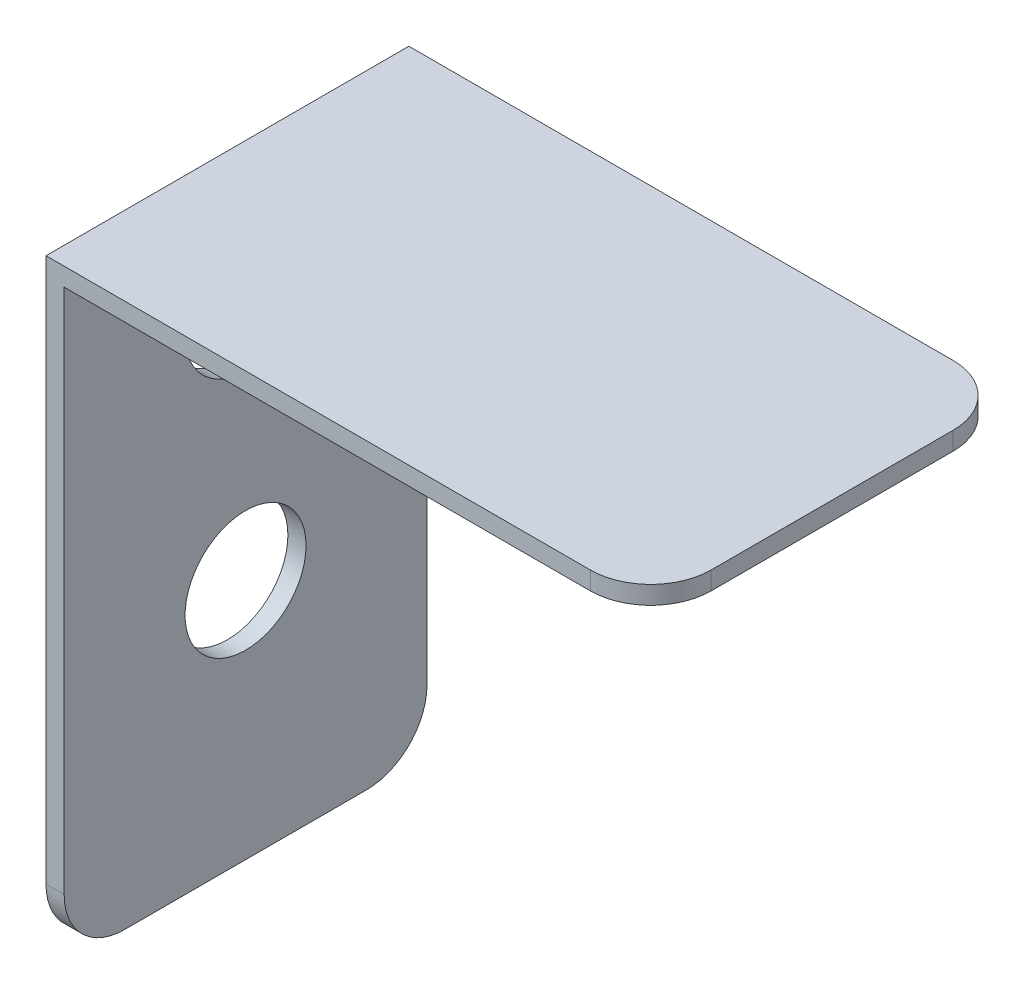
ISO-10303-21;
HEADER;
FILE_DESCRIPTION(('STEP AP214'),'2;1');
FILE_NAME('part.step','',(''),(''),'','','');
FILE_SCHEMA(('AUTOMOTIVE_DESIGN { 1 0 10303 214 1 1 1 1 }'));
ENDSEC;
DATA;
#1=APPLICATION_CONTEXT('core data for automotive mechanical design processes');
#2=APPLICATION_PROTOCOL_DEFINITION('international standard','automotive_design',2000,#1);
#3=PRODUCT_CONTEXT('',#1,'mechanical');
#4=PRODUCT('Part','Part','',(#3));
#5=PRODUCT_RELATED_PRODUCT_CATEGORY('part','',(#4));
#6=PRODUCT_DEFINITION_FORMATION('','',#4);
#7=PRODUCT_DEFINITION_CONTEXT('part definition',#1,'design');
#8=PRODUCT_DEFINITION('design','',#6,#7);
#9=PRODUCT_DEFINITION_SHAPE('','',#8);
#10=(LENGTH_UNIT() NAMED_UNIT(*) SI_UNIT(.MILLI.,.METRE.));
#11=(NAMED_UNIT(*) PLANE_ANGLE_UNIT() SI_UNIT($,.RADIAN.));
#12=(NAMED_UNIT(*) SI_UNIT($,.STERADIAN.) SOLID_ANGLE_UNIT());
#13=UNCERTAINTY_MEASURE_WITH_UNIT(LENGTH_MEASURE(1.E-05),#10,'distance_accuracy_value','');
#14=(GEOMETRIC_REPRESENTATION_CONTEXT(3) GLOBAL_UNCERTAINTY_ASSIGNED_CONTEXT((#13)) GLOBAL_UNIT_ASSIGNED_CONTEXT((#10,
#11,#12)) REPRESENTATION_CONTEXT('',''));
#15=CARTESIAN_POINT('',(0.,0.,0.));
#16=DIRECTION('',(0.,0.,1.));
#17=DIRECTION('',(1.,0.,0.));
#18=AXIS2_PLACEMENT_3D('',#15,#16,#17);
#19=CARTESIAN_POINT('',(0.,0.,60.));
#20=DIRECTION('',(0.,1.,0.));
#21=DIRECTION('',(0.,0.,1.));
#22=AXIS2_PLACEMENT_3D('',#19,#20,#21);
#23=PLANE('',#22);
#24=DIRECTION('',(0.,0.,-1.));
#25=VECTOR('',#24,1.);
#26=CARTESIAN_POINT('',(0.,0.,60.));
#27=LINE('',#26,#25);
#28=CARTESIAN_POINT('',(0.,0.,50.));
#29=VERTEX_POINT('',#28);
#30=CARTESIAN_POINT('',(0.,0.,10.));
#31=VERTEX_POINT('',#30);
#32=EDGE_CURVE('E173',#29,#31,#27,.T.);
#33=ORIENTED_EDGE('',*,*,#32,.T.);
#34=DIRECTION('',(1.,0.,0.));
#35=VECTOR('',#34,1.);
#36=CARTESIAN_POINT('',(0.,0.,10.));
#37=LINE('',#36,#35);
#38=CARTESIAN_POINT('',(3.,0.,10.));
#39=VERTEX_POINT('',#38);
#40=EDGE_CURVE('E201',#31,#39,#37,.T.);
#41=ORIENTED_EDGE('',*,*,#40,.T.);
#42=DIRECTION('',(0.,0.,-1.));
#43=VECTOR('',#42,1.);
#44=CARTESIAN_POINT('',(3.,0.,60.));
#45=LINE('',#44,#43);
#46=CARTESIAN_POINT('',(3.,0.,50.));
#47=VERTEX_POINT('',#46);
#48=EDGE_CURVE('E156',#47,#39,#45,.T.);
#49=ORIENTED_EDGE('',*,*,#48,.F.);
#50=DIRECTION('',(1.,0.,0.));
#51=VECTOR('',#50,1.);
#52=CARTESIAN_POINT('',(0.,0.,50.));
#53=LINE('',#52,#51);
#54=EDGE_CURVE('E205',#47,#29,#53,.F.);
#55=ORIENTED_EDGE('',*,*,#54,.T.);
#56=EDGE_LOOP('',(#33,#41,#49,#55));
#57=FACE_BOUND('',#56,.T.);
#58=ADVANCED_FACE('F50',(#57),#23,.F.);
#59=CARTESIAN_POINT('',(3.,0.,60.));
#60=DIRECTION('',(-1.,0.,0.));
#61=DIRECTION('',(0.,0.,1.));
#62=AXIS2_PLACEMENT_3D('',#59,#60,#61);
#63=PLANE('',#62);
#64=CARTESIAN_POINT('',(3.,40.,30.));
#65=DIRECTION('',(1.,0.,0.));
#66=DIRECTION('',(0.,0.,-1.));
#67=AXIS2_PLACEMENT_3D('',#64,#65,#66);
#68=CIRCLE('',#67,10.);
#69=CARTESIAN_POINT('',(3.,40.,20.));
#70=VERTEX_POINT('',#69);
#71=EDGE_CURVE('E187',#70,#70,#68,.T.);
#72=ORIENTED_EDGE('',*,*,#71,.F.);
#73=EDGE_LOOP('',(#72));
#74=FACE_BOUND('',#73,.T.);
#75=CARTESIAN_POINT('',(3.,80.,30.));
#76=DIRECTION('',(1.,0.,0.));
#77=DIRECTION('',(0.,0.,-1.));
#78=AXIS2_PLACEMENT_3D('',#75,#76,#77);
#79=CIRCLE('',#78,10.);
#80=CARTESIAN_POINT('',(3.,80.,20.));
#81=VERTEX_POINT('',#80);
#82=EDGE_CURVE('E256',#81,#81,#79,.T.);
#83=ORIENTED_EDGE('',*,*,#82,.F.);
#84=EDGE_LOOP('',(#83));
#85=FACE_BOUND('',#84,.T.);
#86=ORIENTED_EDGE('',*,*,#48,.T.);
#87=CARTESIAN_POINT('',(3.,10.,10.));
#88=DIRECTION('',(-1.,0.,0.));
#89=DIRECTION('',(0.,0.,1.));
#90=AXIS2_PLACEMENT_3D('',#87,#88,#89);
#91=CIRCLE('',#90,10.);
#92=CARTESIAN_POINT('',(3.,10.,0.));
#93=VERTEX_POINT('',#92);
#94=EDGE_CURVE('E195',#39,#93,#91,.F.);
#95=ORIENTED_EDGE('',*,*,#94,.T.);
#96=DIRECTION('',(0.,1.,0.));
#97=VECTOR('',#96,1.);
#98=CARTESIAN_POINT('',(3.,0.,0.));
#99=LINE('',#98,#97);
#100=CARTESIAN_POINT('',(3.,97.,0.));
#101=VERTEX_POINT('',#100);
#102=EDGE_CURVE('E151',#93,#101,#99,.T.);
#103=ORIENTED_EDGE('',*,*,#102,.T.);
#104=DIRECTION('',(0.,0.,-1.));
#105=VECTOR('',#104,1.);
#106=CARTESIAN_POINT('',(3.,97.,60.));
#107=LINE('',#106,#105);
#108=CARTESIAN_POINT('',(3.,97.,60.));
#109=VERTEX_POINT('',#108);
#110=EDGE_CURVE('E148',#109,#101,#107,.T.);
#111=ORIENTED_EDGE('',*,*,#110,.F.);
#112=DIRECTION('',(0.,1.,0.));
#113=VECTOR('',#112,1.);
#114=CARTESIAN_POINT('',(3.,0.,60.));
#115=LINE('',#114,#113);
#116=CARTESIAN_POINT('',(3.,10.,60.));
#117=VERTEX_POINT('',#116);
#118=EDGE_CURVE('E135',#117,#109,#115,.T.);
#119=ORIENTED_EDGE('',*,*,#118,.F.);
#120=CARTESIAN_POINT('',(3.,10.,50.));
#121=DIRECTION('',(-1.,0.,0.));
#122=DIRECTION('',(0.,0.,1.));
#123=AXIS2_PLACEMENT_3D('',#120,#121,#122);
#124=CIRCLE('',#123,10.);
#125=EDGE_CURVE('E198',#117,#47,#124,.F.);
#126=ORIENTED_EDGE('',*,*,#125,.T.);
#127=EDGE_LOOP('',(#86,#95,#103,#111,#119,#126));
#128=FACE_BOUND('',#127,.T.);
#129=ADVANCED_FACE('F150',(#74,#85,#128),#63,.F.);
#130=CARTESIAN_POINT('',(3.,97.,60.));
#131=DIRECTION('',(0.,1.,0.));
#132=DIRECTION('',(0.,0.,1.));
#133=AXIS2_PLACEMENT_3D('',#130,#131,#132);
#134=PLANE('',#133);
#135=DIRECTION('',(1.,0.,0.));
#136=VECTOR('',#135,1.);
#137=CARTESIAN_POINT('',(3.,97.,0.));
#138=LINE('',#137,#136);
#139=CARTESIAN_POINT('',(90.,97.,0.));
#140=VERTEX_POINT('',#139);
#141=EDGE_CURVE('E176',#101,#140,#138,.T.);
#142=ORIENTED_EDGE('',*,*,#141,.T.);
#143=CARTESIAN_POINT('',(90.,97.,10.));
#144=DIRECTION('',(0.,1.,0.));
#145=DIRECTION('',(0.,0.,1.));
#146=AXIS2_PLACEMENT_3D('',#143,#144,#145);
#147=CIRCLE('',#146,10.);
#148=CARTESIAN_POINT('',(100.,97.,10.));
#149=VERTEX_POINT('',#148);
#150=EDGE_CURVE('E211',#140,#149,#147,.F.);
#151=ORIENTED_EDGE('',*,*,#150,.T.);
#152=DIRECTION('',(0.,0.,-1.));
#153=VECTOR('',#152,1.);
#154=CARTESIAN_POINT('',(100.,97.,60.));
#155=LINE('',#154,#153);
#156=CARTESIAN_POINT('',(100.,97.,50.));
#157=VERTEX_POINT('',#156);
#158=EDGE_CURVE('E157',#157,#149,#155,.T.);
#159=ORIENTED_EDGE('',*,*,#158,.F.);
#160=CARTESIAN_POINT('',(90.,97.,50.));
#161=DIRECTION('',(0.,1.,0.));
#162=DIRECTION('',(0.,0.,1.));
#163=AXIS2_PLACEMENT_3D('',#160,#161,#162);
#164=CIRCLE('',#163,10.);
#165=CARTESIAN_POINT('',(90.,97.,60.));
#166=VERTEX_POINT('',#165);
#167=EDGE_CURVE('E162',#157,#166,#164,.F.);
#168=ORIENTED_EDGE('',*,*,#167,.T.);
#169=DIRECTION('',(1.,0.,0.));
#170=VECTOR('',#169,1.);
#171=CARTESIAN_POINT('',(3.,97.,60.));
#172=LINE('',#171,#170);
#173=EDGE_CURVE('E140',#109,#166,#172,.T.);
#174=ORIENTED_EDGE('',*,*,#173,.F.);
#175=ORIENTED_EDGE('',*,*,#110,.T.);
#176=EDGE_LOOP('',(#142,#151,#159,#168,#174,#175));
#177=FACE_BOUND('',#176,.T.);
#178=ADVANCED_FACE('F159',(#177),#134,.F.);
#179=CARTESIAN_POINT('',(100.,100.,60.));
#180=DIRECTION('',(-1.,0.,0.));
#181=DIRECTION('',(0.,0.,1.));
#182=AXIS2_PLACEMENT_3D('',#179,#180,#181);
#183=PLANE('',#182);
#184=ORIENTED_EDGE('',*,*,#158,.T.);
#185=DIRECTION('',(0.,1.,0.));
#186=VECTOR('',#185,1.);
#187=CARTESIAN_POINT('',(100.,100.,10.));
#188=LINE('',#187,#186);
#189=CARTESIAN_POINT('',(100.,100.,10.));
#190=VERTEX_POINT('',#189);
#191=EDGE_CURVE('E225',#149,#190,#188,.T.);
#192=ORIENTED_EDGE('',*,*,#191,.T.);
#193=DIRECTION('',(0.,0.,-1.));
#194=VECTOR('',#193,1.);
#195=CARTESIAN_POINT('',(100.,100.,60.));
#196=LINE('',#195,#194);
#197=CARTESIAN_POINT('',(100.,100.,50.));
#198=VERTEX_POINT('',#197);
#199=EDGE_CURVE('E237',#198,#190,#196,.T.);
#200=ORIENTED_EDGE('',*,*,#199,.F.);
#201=DIRECTION('',(0.,1.,0.));
#202=VECTOR('',#201,1.);
#203=CARTESIAN_POINT('',(100.,97.,50.));
#204=LINE('',#203,#202);
#205=EDGE_CURVE('E229',#198,#157,#204,.F.);
#206=ORIENTED_EDGE('',*,*,#205,.T.);
#207=EDGE_LOOP('',(#184,#192,#200,#206));
#208=FACE_BOUND('',#207,.T.);
#209=ADVANCED_FACE('F271',(#208),#183,.F.);
#210=CARTESIAN_POINT('',(0.,100.,60.));
#211=DIRECTION('',(0.,-1.,0.));
#212=DIRECTION('',(0.,0.,-1.));
#213=AXIS2_PLACEMENT_3D('',#210,#211,#212);
#214=PLANE('',#213);
#215=ORIENTED_EDGE('',*,*,#199,.T.);
#216=CARTESIAN_POINT('',(90.,100.,10.));
#217=DIRECTION('',(0.,-1.,0.));
#218=DIRECTION('',(0.,0.,-1.));
#219=AXIS2_PLACEMENT_3D('',#216,#217,#218);
#220=CIRCLE('',#219,10.);
#221=CARTESIAN_POINT('',(90.,100.,0.));
#222=VERTEX_POINT('',#221);
#223=EDGE_CURVE('E219',#190,#222,#220,.F.);
#224=ORIENTED_EDGE('',*,*,#223,.T.);
#225=DIRECTION('',(-1.,0.,0.));
#226=VECTOR('',#225,1.);
#227=CARTESIAN_POINT('',(0.,100.,0.));
#228=LINE('',#227,#226);
#229=CARTESIAN_POINT('',(0.,100.,0.));
#230=VERTEX_POINT('',#229);
#231=EDGE_CURVE('E249',#222,#230,#228,.T.);
#232=ORIENTED_EDGE('',*,*,#231,.T.);
#233=DIRECTION('',(0.,0.,-1.));
#234=VECTOR('',#233,1.);
#235=CARTESIAN_POINT('',(0.,100.,60.));
#236=LINE('',#235,#234);
#237=CARTESIAN_POINT('',(0.,100.,60.));
#238=VERTEX_POINT('',#237);
#239=EDGE_CURVE('E241',#238,#230,#236,.T.);
#240=ORIENTED_EDGE('',*,*,#239,.F.);
#241=DIRECTION('',(-1.,0.,0.));
#242=VECTOR('',#241,1.);
#243=CARTESIAN_POINT('',(0.,100.,60.));
#244=LINE('',#243,#242);
#245=CARTESIAN_POINT('',(90.,100.,60.));
#246=VERTEX_POINT('',#245);
#247=EDGE_CURVE('E164',#246,#238,#244,.T.);
#248=ORIENTED_EDGE('',*,*,#247,.F.);
#249=CARTESIAN_POINT('',(90.,100.,50.));
#250=DIRECTION('',(0.,-1.,0.));
#251=DIRECTION('',(0.,0.,-1.));
#252=AXIS2_PLACEMENT_3D('',#249,#250,#251);
#253=CIRCLE('',#252,10.);
#254=EDGE_CURVE('E222',#246,#198,#253,.F.);
#255=ORIENTED_EDGE('',*,*,#254,.T.);
#256=EDGE_LOOP('',(#215,#224,#232,#240,#248,#255));
#257=FACE_BOUND('',#256,.T.);
#258=ADVANCED_FACE('F323',(#257),#214,.F.);
#259=CARTESIAN_POINT('',(0.,0.,60.));
#260=DIRECTION('',(1.,0.,0.));
#261=DIRECTION('',(0.,0.,-1.));
#262=AXIS2_PLACEMENT_3D('',#259,#260,#261);
#263=PLANE('',#262);
#264=CARTESIAN_POINT('',(0.,40.,30.));
#265=DIRECTION('',(1.,0.,0.));
#266=DIRECTION('',(0.,0.,-1.));
#267=AXIS2_PLACEMENT_3D('',#264,#265,#266);
#268=CIRCLE('',#267,10.);
#269=CARTESIAN_POINT('',(0.,40.,20.));
#270=VERTEX_POINT('',#269);
#271=EDGE_CURVE('E54',#270,#270,#268,.T.);
#272=ORIENTED_EDGE('',*,*,#271,.T.);
#273=EDGE_LOOP('',(#272));
#274=FACE_BOUND('',#273,.T.);
#275=CARTESIAN_POINT('',(0.,80.,30.));
#276=DIRECTION('',(1.,0.,0.));
#277=DIRECTION('',(0.,0.,-1.));
#278=AXIS2_PLACEMENT_3D('',#275,#276,#277);
#279=CIRCLE('',#278,10.);
#280=CARTESIAN_POINT('',(0.,80.,20.));
#281=VERTEX_POINT('',#280);
#282=EDGE_CURVE('E183',#281,#281,#279,.T.);
#283=ORIENTED_EDGE('',*,*,#282,.T.);
#284=EDGE_LOOP('',(#283));
#285=FACE_BOUND('',#284,.T.);
#286=DIRECTION('',(0.,-1.,0.));
#287=VECTOR('',#286,1.);
#288=CARTESIAN_POINT('',(0.,0.,0.));
#289=LINE('',#288,#287);
#290=CARTESIAN_POINT('',(0.,10.,0.));
#291=VERTEX_POINT('',#290);
#292=EDGE_CURVE('E145',#230,#291,#289,.T.);
#293=ORIENTED_EDGE('',*,*,#292,.T.);
#294=CARTESIAN_POINT('',(0.,10.,10.));
#295=DIRECTION('',(1.,0.,0.));
#296=DIRECTION('',(0.,0.,-1.));
#297=AXIS2_PLACEMENT_3D('',#294,#295,#296);
#298=CIRCLE('',#297,10.);
#299=EDGE_CURVE('E61',#291,#31,#298,.F.);
#300=ORIENTED_EDGE('',*,*,#299,.T.);
#301=ORIENTED_EDGE('',*,*,#32,.F.);
#302=CARTESIAN_POINT('',(0.,10.,50.));
#303=DIRECTION('',(1.,0.,0.));
#304=DIRECTION('',(0.,0.,-1.));
#305=AXIS2_PLACEMENT_3D('',#302,#303,#304);
#306=CIRCLE('',#305,10.);
#307=CARTESIAN_POINT('',(0.,10.,60.));
#308=VERTEX_POINT('',#307);
#309=EDGE_CURVE('E69',#29,#308,#306,.F.);
#310=ORIENTED_EDGE('',*,*,#309,.T.);
#311=DIRECTION('',(0.,-1.,0.));
#312=VECTOR('',#311,1.);
#313=CARTESIAN_POINT('',(0.,0.,60.));
#314=LINE('',#313,#312);
#315=EDGE_CURVE('E167',#238,#308,#314,.T.);
#316=ORIENTED_EDGE('',*,*,#315,.F.);
#317=ORIENTED_EDGE('',*,*,#239,.T.);
#318=EDGE_LOOP('',(#293,#300,#301,#310,#316,#317));
#319=FACE_BOUND('',#318,.T.);
#320=ADVANCED_FACE('F295',(#274,#285,#319),#263,.F.);
#321=CARTESIAN_POINT('',(0.,0.,60.));
#322=DIRECTION('',(0.,0.,1.));
#323=DIRECTION('',(1.,0.,0.));
#324=AXIS2_PLACEMENT_3D('',#321,#322,#323);
#325=PLANE('',#324);
#326=ORIENTED_EDGE('',*,*,#315,.T.);
#327=DIRECTION('',(1.,0.,0.));
#328=VECTOR('',#327,1.);
#329=CARTESIAN_POINT('',(3.,10.,60.));
#330=LINE('',#329,#328);
#331=EDGE_CURVE('E12',#308,#117,#330,.T.);
#332=ORIENTED_EDGE('',*,*,#331,.T.);
#333=ORIENTED_EDGE('',*,*,#118,.T.);
#334=ORIENTED_EDGE('',*,*,#173,.T.);
#335=DIRECTION('',(0.,1.,0.));
#336=VECTOR('',#335,1.);
#337=CARTESIAN_POINT('',(90.,100.,60.));
#338=LINE('',#337,#336);
#339=EDGE_CURVE('E208',#166,#246,#338,.T.);
#340=ORIENTED_EDGE('',*,*,#339,.T.);
#341=ORIENTED_EDGE('',*,*,#247,.T.);
#342=EDGE_LOOP('',(#326,#332,#333,#334,#340,#341));
#343=FACE_BOUND('',#342,.T.);
#344=ADVANCED_FACE('F137',(#343),#325,.T.);
#345=CARTESIAN_POINT('',(0.,0.,0.));
#346=DIRECTION('',(0.,0.,1.));
#347=DIRECTION('',(1.,0.,0.));
#348=AXIS2_PLACEMENT_3D('',#345,#346,#347);
#349=PLANE('',#348);
#350=ORIENTED_EDGE('',*,*,#102,.F.);
#351=DIRECTION('',(1.,0.,0.));
#352=VECTOR('',#351,1.);
#353=CARTESIAN_POINT('',(0.,10.,0.));
#354=LINE('',#353,#352);
#355=EDGE_CURVE('E77',#93,#291,#354,.F.);
#356=ORIENTED_EDGE('',*,*,#355,.T.);
#357=ORIENTED_EDGE('',*,*,#292,.F.);
#358=ORIENTED_EDGE('',*,*,#231,.F.);
#359=DIRECTION('',(0.,1.,0.));
#360=VECTOR('',#359,1.);
#361=CARTESIAN_POINT('',(90.,0.,0.));
#362=LINE('',#361,#360);
#363=EDGE_CURVE('E216',#222,#140,#362,.F.);
#364=ORIENTED_EDGE('',*,*,#363,.T.);
#365=ORIENTED_EDGE('',*,*,#141,.F.);
#366=EDGE_LOOP('',(#350,#356,#357,#358,#364,#365));
#367=FACE_BOUND('',#366,.T.);
#368=ADVANCED_FACE('F282',(#367),#349,.F.);
#369=CARTESIAN_POINT('',(90.,100.,10.));
#370=DIRECTION('',(0.,1.,0.));
#371=DIRECTION('',(0.,0.,1.));
#372=AXIS2_PLACEMENT_3D('',#369,#370,#371);
#373=CYLINDRICAL_SURFACE('',#372,10.);
#374=ORIENTED_EDGE('',*,*,#150,.F.);
#375=ORIENTED_EDGE('',*,*,#363,.F.);
#376=ORIENTED_EDGE('',*,*,#223,.F.);
#377=ORIENTED_EDGE('',*,*,#191,.F.);
#378=EDGE_LOOP('',(#374,#375,#376,#377));
#379=FACE_BOUND('',#378,.T.);
#380=ADVANCED_FACE('F278',(#379),#373,.T.);
#381=CARTESIAN_POINT('',(90.,0.,50.));
#382=DIRECTION('',(0.,-1.,0.));
#383=DIRECTION('',(0.,0.,-1.));
#384=AXIS2_PLACEMENT_3D('',#381,#382,#383);
#385=CYLINDRICAL_SURFACE('',#384,10.);
#386=ORIENTED_EDGE('',*,*,#167,.F.);
#387=ORIENTED_EDGE('',*,*,#205,.F.);
#388=ORIENTED_EDGE('',*,*,#254,.F.);
#389=ORIENTED_EDGE('',*,*,#339,.F.);
#390=EDGE_LOOP('',(#386,#387,#388,#389));
#391=FACE_BOUND('',#390,.T.);
#392=ADVANCED_FACE('F281',(#391),#385,.T.);
#393=CARTESIAN_POINT('',(0.,10.,10.));
#394=DIRECTION('',(1.,0.,0.));
#395=DIRECTION('',(0.,0.,-1.));
#396=AXIS2_PLACEMENT_3D('',#393,#394,#395);
#397=CYLINDRICAL_SURFACE('',#396,10.);
#398=ORIENTED_EDGE('',*,*,#299,.F.);
#399=ORIENTED_EDGE('',*,*,#355,.F.);
#400=ORIENTED_EDGE('',*,*,#94,.F.);
#401=ORIENTED_EDGE('',*,*,#40,.F.);
#402=EDGE_LOOP('',(#398,#399,#400,#401));
#403=FACE_BOUND('',#402,.T.);
#404=ADVANCED_FACE('F285',(#403),#397,.T.);
#405=CARTESIAN_POINT('',(0.,10.,50.));
#406=DIRECTION('',(-1.,0.,0.));
#407=DIRECTION('',(0.,0.,1.));
#408=AXIS2_PLACEMENT_3D('',#405,#406,#407);
#409=CYLINDRICAL_SURFACE('',#408,10.);
#410=ORIENTED_EDGE('',*,*,#309,.F.);
#411=ORIENTED_EDGE('',*,*,#54,.F.);
#412=ORIENTED_EDGE('',*,*,#125,.F.);
#413=ORIENTED_EDGE('',*,*,#331,.F.);
#414=EDGE_LOOP('',(#410,#411,#412,#413));
#415=FACE_BOUND('',#414,.T.);
#416=ADVANCED_FACE('F52',(#415),#409,.T.);
#417=CARTESIAN_POINT('',(-57.,80.,30.));
#418=DIRECTION('',(1.,0.,0.));
#419=DIRECTION('',(0.,0.,-1.));
#420=AXIS2_PLACEMENT_3D('',#417,#418,#419);
#421=CYLINDRICAL_SURFACE('',#420,10.);
#422=ORIENTED_EDGE('',*,*,#82,.T.);
#423=EDGE_LOOP('',(#422));
#424=FACE_BOUND('',#423,.T.);
#425=ORIENTED_EDGE('',*,*,#282,.F.);
#426=EDGE_LOOP('',(#425));
#427=FACE_BOUND('',#426,.T.);
#428=ADVANCED_FACE('F261',(#424,#427),#421,.F.);
#429=CARTESIAN_POINT('',(-57.,40.,30.));
#430=DIRECTION('',(1.,0.,0.));
#431=DIRECTION('',(0.,0.,-1.));
#432=AXIS2_PLACEMENT_3D('',#429,#430,#431);
#433=CYLINDRICAL_SURFACE('',#432,10.);
#434=ORIENTED_EDGE('',*,*,#71,.T.);
#435=EDGE_LOOP('',(#434));
#436=FACE_BOUND('',#435,.T.);
#437=ORIENTED_EDGE('',*,*,#271,.F.);
#438=EDGE_LOOP('',(#437));
#439=FACE_BOUND('',#438,.T.);
#440=ADVANCED_FACE('F308',(#436,#439),#433,.F.);
#441=CLOSED_SHELL('',(#58,#129,#178,#209,#258,#320,#344,#368,#380,#392,#404,#416,#428,#440));
#442=MANIFOLD_SOLID_BREP('B2',#441);
#443=ADVANCED_BREP_SHAPE_REPRESENTATION('',(#18,#442),#14);
#444=SHAPE_DEFINITION_REPRESENTATION(#9,#443);
ENDSEC;
END-ISO-10303-21;
